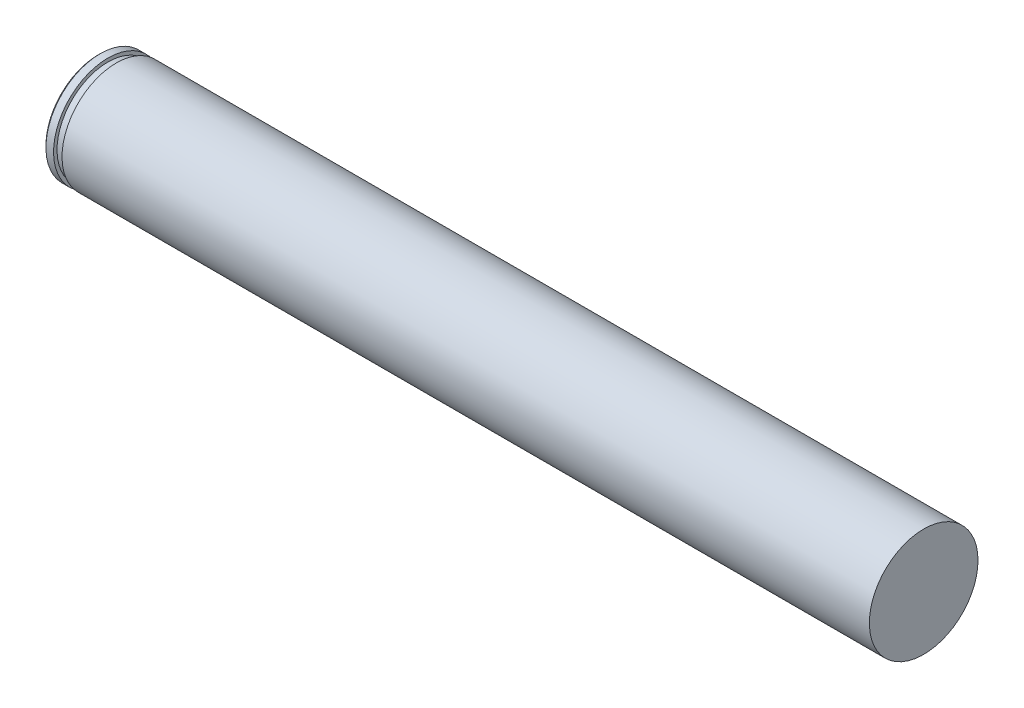
ISO-10303-21;
HEADER;
FILE_DESCRIPTION(('STEP AP214'),'2;1');
FILE_NAME('part.step','',(''),(''),'','','');
FILE_SCHEMA(('AUTOMOTIVE_DESIGN { 1 0 10303 214 1 1 1 1 }'));
ENDSEC;
DATA;
#1=APPLICATION_CONTEXT('core data for automotive mechanical design processes');
#2=APPLICATION_PROTOCOL_DEFINITION('international standard','automotive_design',2000,#1);
#3=PRODUCT_CONTEXT('',#1,'mechanical');
#4=PRODUCT('Part','Part','',(#3));
#5=PRODUCT_RELATED_PRODUCT_CATEGORY('part','',(#4));
#6=PRODUCT_DEFINITION_FORMATION('','',#4);
#7=PRODUCT_DEFINITION_CONTEXT('part definition',#1,'design');
#8=PRODUCT_DEFINITION('design','',#6,#7);
#9=PRODUCT_DEFINITION_SHAPE('','',#8);
#10=(LENGTH_UNIT() NAMED_UNIT(*) SI_UNIT(.MILLI.,.METRE.));
#11=(NAMED_UNIT(*) PLANE_ANGLE_UNIT() SI_UNIT($,.RADIAN.));
#12=(NAMED_UNIT(*) SI_UNIT($,.STERADIAN.) SOLID_ANGLE_UNIT());
#13=UNCERTAINTY_MEASURE_WITH_UNIT(LENGTH_MEASURE(1.E-05),#10,'distance_accuracy_value','');
#14=(GEOMETRIC_REPRESENTATION_CONTEXT(3) GLOBAL_UNCERTAINTY_ASSIGNED_CONTEXT((#13)) GLOBAL_UNIT_ASSIGNED_CONTEXT((#10,
#11,#12)) REPRESENTATION_CONTEXT('',''));
#15=CARTESIAN_POINT('',(0.,0.,0.));
#16=DIRECTION('',(0.,0.,1.));
#17=DIRECTION('',(1.,0.,0.));
#18=AXIS2_PLACEMENT_3D('',#15,#16,#17);
#19=CARTESIAN_POINT('',(434.249127465092,414.92185184223,0.));
#20=DIRECTION('',(1.,0.,0.));
#21=DIRECTION('',(0.,1.,0.));
#22=AXIS2_PLACEMENT_3D('',#19,#20,#21);
#23=CYLINDRICAL_SURFACE('',#22,6.34999999999962);
#24=CARTESIAN_POINT('',(386.840027465092,414.92185184223,0.));
#25=DIRECTION('',(1.,0.,0.));
#26=DIRECTION('',(0.,1.,0.));
#27=AXIS2_PLACEMENT_3D('',#24,#25,#26);
#28=CIRCLE('',#27,6.34999999999962);
#29=CARTESIAN_POINT('',(386.840027465092,421.27185184223,0.));
#30=VERTEX_POINT('',#29);
#31=EDGE_CURVE('E10',#30,#30,#28,.T.);
#32=ORIENTED_EDGE('',*,*,#31,.T.);
#33=EDGE_LOOP('',(#32));
#34=FACE_BOUND('',#33,.T.);
#35=CARTESIAN_POINT('',(481.226427465092,414.92185184223,0.));
#36=DIRECTION('',(1.,0.,0.));
#37=DIRECTION('',(0.,0.,-1.));
#38=AXIS2_PLACEMENT_3D('',#35,#36,#37);
#39=CIRCLE('',#38,6.34999999999963);
#40=CARTESIAN_POINT('',(481.226427465092,414.92185184223,-6.34999999999963));
#41=VERTEX_POINT('',#40);
#42=EDGE_CURVE('E61',#41,#41,#39,.T.);
#43=ORIENTED_EDGE('',*,*,#42,.F.);
#44=EDGE_LOOP('',(#43));
#45=FACE_BOUND('',#44,.T.);
#46=ADVANCED_FACE('F32',(#34,#45),#23,.T.);
#47=CARTESIAN_POINT('',(384.706427465092,418.09685184223,0.));
#48=DIRECTION('',(-1.,0.,0.));
#49=DIRECTION('',(0.,0.,1.));
#50=AXIS2_PLACEMENT_3D('',#47,#48,#49);
#51=PLANE('',#50);
#52=CARTESIAN_POINT('',(384.706427464891,414.92185184223,0.));
#53=DIRECTION('',(1.,0.,0.));
#54=DIRECTION('',(0.,0.,-1.));
#55=AXIS2_PLACEMENT_3D('',#52,#53,#54);
#56=CIRCLE('',#55,6.09600000007765);
#57=CARTESIAN_POINT('',(384.706427464891,414.92185184223,-6.09600000007765));
#58=VERTEX_POINT('',#57);
#59=EDGE_CURVE('E36',#58,#58,#56,.T.);
#60=ORIENTED_EDGE('',*,*,#59,.F.);
#61=EDGE_LOOP('',(#60));
#62=FACE_BOUND('',#61,.T.);
#63=ADVANCED_FACE('F34',(#62),#51,.T.);
#64=CARTESIAN_POINT('',(384.960427465103,414.92185184223,0.));
#65=DIRECTION('',(1.,0.,0.));
#66=DIRECTION('',(0.,0.,-1.));
#67=AXIS2_PLACEMENT_3D('',#64,#65,#66);
#68=CONICAL_SURFACE('',#67,6.34999999983427,0.785398162502276);
#69=CARTESIAN_POINT('',(384.960427465092,414.92185184223,0.));
#70=DIRECTION('',(1.,0.,0.));
#71=DIRECTION('',(0.,1.,0.));
#72=AXIS2_PLACEMENT_3D('',#69,#70,#71);
#73=CIRCLE('',#72,6.34999999999998);
#74=CARTESIAN_POINT('',(384.960427465092,421.27185184223,0.));
#75=VERTEX_POINT('',#74);
#76=EDGE_CURVE('E54',#75,#75,#73,.T.);
#77=ORIENTED_EDGE('',*,*,#76,.F.);
#78=EDGE_LOOP('',(#77));
#79=FACE_BOUND('',#78,.T.);
#80=ORIENTED_EDGE('',*,*,#59,.T.);
#81=EDGE_LOOP('',(#80));
#82=FACE_BOUND('',#81,.T.);
#83=ADVANCED_FACE('F74',(#79,#82),#68,.T.);
#84=CARTESIAN_POINT('',(385.277927465092,414.92185184223,0.));
#85=DIRECTION('',(1.,0.,0.));
#86=DIRECTION('',(0.,1.,0.));
#87=AXIS2_PLACEMENT_3D('',#84,#85,#86);
#88=CYLINDRICAL_SURFACE('',#87,6.34999999999998);
#89=ORIENTED_EDGE('',*,*,#76,.T.);
#90=EDGE_LOOP('',(#89));
#91=FACE_BOUND('',#90,.T.);
#92=CARTESIAN_POINT('',(385.849427465092,414.92185184223,0.));
#93=DIRECTION('',(1.,0.,0.));
#94=DIRECTION('',(0.,1.,0.));
#95=AXIS2_PLACEMENT_3D('',#92,#93,#94);
#96=CIRCLE('',#95,6.34999999999998);
#97=CARTESIAN_POINT('',(385.849427465092,421.27185184223,0.));
#98=VERTEX_POINT('',#97);
#99=EDGE_CURVE('E52',#98,#98,#96,.T.);
#100=ORIENTED_EDGE('',*,*,#99,.F.);
#101=EDGE_LOOP('',(#100));
#102=FACE_BOUND('',#101,.T.);
#103=ADVANCED_FACE('F92',(#91,#102),#88,.T.);
#104=CARTESIAN_POINT('',(385.849427465092,421.06865184223,0.));
#105=DIRECTION('',(1.,0.,0.));
#106=DIRECTION('',(0.,0.,-1.));
#107=AXIS2_PLACEMENT_3D('',#104,#105,#106);
#108=PLANE('',#107);
#109=CARTESIAN_POINT('',(385.849427465092,414.92185184223,0.));
#110=DIRECTION('',(1.,0.,0.));
#111=DIRECTION('',(0.,1.,0.));
#112=AXIS2_PLACEMENT_3D('',#109,#110,#111);
#113=CIRCLE('',#112,5.94359999999952);
#114=CARTESIAN_POINT('',(385.849427465092,420.86545184223,0.));
#115=VERTEX_POINT('',#114);
#116=EDGE_CURVE('E45',#115,#115,#113,.T.);
#117=ORIENTED_EDGE('',*,*,#116,.F.);
#118=EDGE_LOOP('',(#117));
#119=FACE_BOUND('',#118,.T.);
#120=ORIENTED_EDGE('',*,*,#99,.T.);
#121=EDGE_LOOP('',(#120));
#122=FACE_BOUND('',#121,.T.);
#123=ADVANCED_FACE('F85',(#119,#122),#108,.T.);
#124=CARTESIAN_POINT('',(386.344727465092,414.92185184223,0.));
#125=DIRECTION('',(1.,0.,0.));
#126=DIRECTION('',(0.,1.,0.));
#127=AXIS2_PLACEMENT_3D('',#124,#125,#126);
#128=CYLINDRICAL_SURFACE('',#127,5.94359999999952);
#129=ORIENTED_EDGE('',*,*,#116,.T.);
#130=EDGE_LOOP('',(#129));
#131=FACE_BOUND('',#130,.T.);
#132=CARTESIAN_POINT('',(386.840027465092,414.92185184223,0.));
#133=DIRECTION('',(1.,0.,0.));
#134=DIRECTION('',(0.,1.,0.));
#135=AXIS2_PLACEMENT_3D('',#132,#133,#134);
#136=CIRCLE('',#135,5.94359999999952);
#137=CARTESIAN_POINT('',(386.840027465092,420.86545184223,0.));
#138=VERTEX_POINT('',#137);
#139=EDGE_CURVE('E40',#138,#138,#136,.T.);
#140=ORIENTED_EDGE('',*,*,#139,.F.);
#141=EDGE_LOOP('',(#140));
#142=FACE_BOUND('',#141,.T.);
#143=ADVANCED_FACE('F79',(#131,#142),#128,.T.);
#144=CARTESIAN_POINT('',(386.840027465092,421.06865184223,0.));
#145=DIRECTION('',(-1.,0.,0.));
#146=DIRECTION('',(0.,0.,1.));
#147=AXIS2_PLACEMENT_3D('',#144,#145,#146);
#148=PLANE('',#147);
#149=ORIENTED_EDGE('',*,*,#139,.T.);
#150=EDGE_LOOP('',(#149));
#151=FACE_BOUND('',#150,.T.);
#152=ORIENTED_EDGE('',*,*,#31,.F.);
#153=EDGE_LOOP('',(#152));
#154=FACE_BOUND('',#153,.T.);
#155=ADVANCED_FACE('F70',(#151,#154),#148,.T.);
#156=CARTESIAN_POINT('',(481.226427465092,414.92185184223,0.));
#157=DIRECTION('',(1.,0.,0.));
#158=DIRECTION('',(0.,0.,-1.));
#159=AXIS2_PLACEMENT_3D('',#156,#157,#158);
#160=PLANE('',#159);
#161=ORIENTED_EDGE('',*,*,#42,.T.);
#162=EDGE_LOOP('',(#161));
#163=FACE_BOUND('',#162,.T.);
#164=ADVANCED_FACE('F66',(#163),#160,.T.);
#165=CLOSED_SHELL('',(#46,#63,#83,#103,#123,#143,#155,#164));
#166=MANIFOLD_SOLID_BREP('B2',#165);
#167=ADVANCED_BREP_SHAPE_REPRESENTATION('',(#18,#166),#14);
#168=SHAPE_DEFINITION_REPRESENTATION(#9,#167);
ENDSEC;
END-ISO-10303-21;
